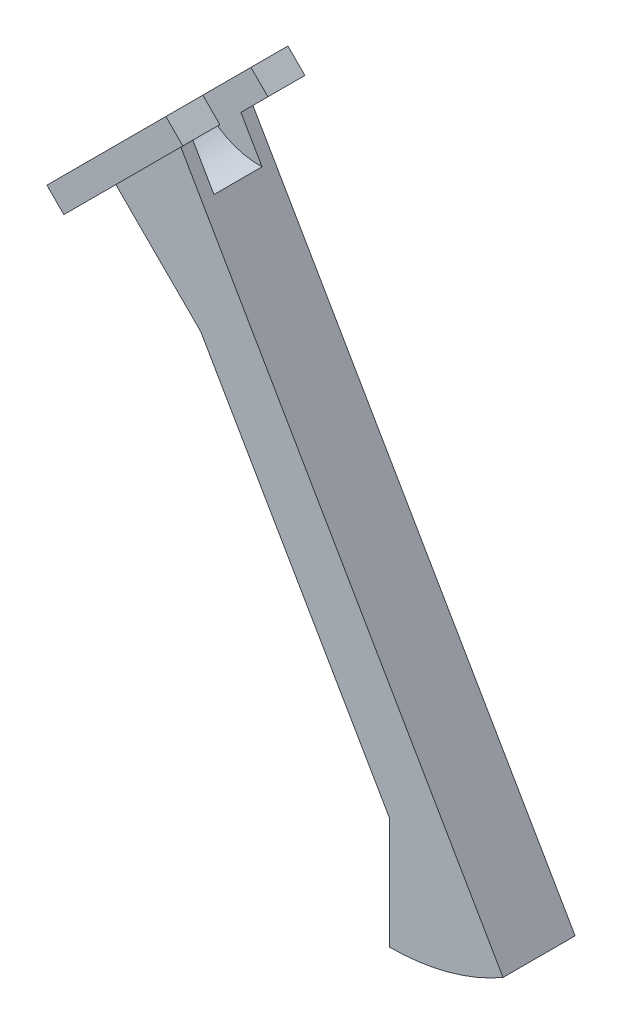
ISO-10303-21;
HEADER;
FILE_DESCRIPTION(('STEP AP214'),'2;1');
FILE_NAME('part.step','',(''),(''),'','','');
FILE_SCHEMA(('AUTOMOTIVE_DESIGN { 1 0 10303 214 1 1 1 1 }'));
ENDSEC;
DATA;
#1=APPLICATION_CONTEXT('core data for automotive mechanical design processes');
#2=APPLICATION_PROTOCOL_DEFINITION('international standard','automotive_design',2000,#1);
#3=PRODUCT_CONTEXT('',#1,'mechanical');
#4=PRODUCT('Part','Part','',(#3));
#5=PRODUCT_RELATED_PRODUCT_CATEGORY('part','',(#4));
#6=PRODUCT_DEFINITION_FORMATION('','',#4);
#7=PRODUCT_DEFINITION_CONTEXT('part definition',#1,'design');
#8=PRODUCT_DEFINITION('design','',#6,#7);
#9=PRODUCT_DEFINITION_SHAPE('','',#8);
#10=(LENGTH_UNIT() NAMED_UNIT(*) SI_UNIT(.MILLI.,.METRE.));
#11=(NAMED_UNIT(*) PLANE_ANGLE_UNIT() SI_UNIT($,.RADIAN.));
#12=(NAMED_UNIT(*) SI_UNIT($,.STERADIAN.) SOLID_ANGLE_UNIT());
#13=UNCERTAINTY_MEASURE_WITH_UNIT(LENGTH_MEASURE(1.E-05),#10,'distance_accuracy_value','');
#14=(GEOMETRIC_REPRESENTATION_CONTEXT(3) GLOBAL_UNCERTAINTY_ASSIGNED_CONTEXT((#13)) GLOBAL_UNIT_ASSIGNED_CONTEXT((#10,
#11,#12)) REPRESENTATION_CONTEXT('',''));
#15=CARTESIAN_POINT('',(0.,0.,0.));
#16=DIRECTION('',(0.,0.,1.));
#17=DIRECTION('',(1.,0.,0.));
#18=AXIS2_PLACEMENT_3D('',#15,#16,#17);
#19=CARTESIAN_POINT('',(-91.2899227988557,91.2899227988554,0.));
#20=DIRECTION('',(0.707106781186549,-0.707106781186546,0.));
#21=DIRECTION('',(0.707106781186546,0.707106781186549,0.));
#22=AXIS2_PLACEMENT_3D('',#19,#20,#21);
#23=PLANE('',#22);
#24=CARTESIAN_POINT('',(-52.1767999017434,130.403045695968,9.52499999999999));
#25=DIRECTION('',(-0.707106781186549,0.707106781186546,0.));
#26=DIRECTION('',(-0.707106781186546,-0.707106781186549,0.));
#27=AXIS2_PLACEMENT_3D('',#24,#25,#26);
#28=CIRCLE('',#27,1.525);
#29=CARTESIAN_POINT('',(-53.2551377430529,129.324707854658,9.52499999999999));
#30=VERTEX_POINT('',#29);
#31=EDGE_CURVE('E194',#30,#30,#28,.T.);
#32=ORIENTED_EDGE('',*,*,#31,.F.);
#33=EDGE_LOOP('',(#32));
#34=FACE_BOUND('',#33,.T.);
#35=DIRECTION('',(0.,0.,1.));
#36=VECTOR('',#35,1.);
#37=CARTESIAN_POINT('',(-59.7854099052376,122.794435692474,-5.));
#38=LINE('',#37,#36);
#39=CARTESIAN_POINT('',(-59.7854099052376,122.794435692474,5.));
#40=VERTEX_POINT('',#39);
#41=CARTESIAN_POINT('',(-59.7854099052376,122.794435692474,-5.));
#42=VERTEX_POINT('',#41);
#43=EDGE_CURVE('E43',#40,#42,#38,.F.);
#44=ORIENTED_EDGE('',*,*,#43,.T.);
#45=DIRECTION('',(-0.707106781186546,-0.707106781186549,0.));
#46=VECTOR('',#45,1.);
#47=CARTESIAN_POINT('',(-91.2899227988557,91.2899227988554,-5.));
#48=LINE('',#47,#46);
#49=CARTESIAN_POINT('',(-49.3271595735617,133.25268602415,-5.));
#50=VERTEX_POINT('',#49);
#51=EDGE_CURVE('E11',#50,#42,#48,.T.);
#52=ORIENTED_EDGE('',*,*,#51,.F.);
#53=DIRECTION('',(0.,0.,-1.));
#54=VECTOR('',#53,1.);
#55=CARTESIAN_POINT('',(-49.3271595735617,133.25268602415,-12.7));
#56=LINE('',#55,#54);
#57=CARTESIAN_POINT('',(-49.3271595735617,133.25268602415,-12.7));
#58=VERTEX_POINT('',#57);
#59=EDGE_CURVE('E248',#50,#58,#56,.T.);
#60=ORIENTED_EDGE('',*,*,#59,.T.);
#61=DIRECTION('',(-0.707106781186546,-0.707106781186549,0.));
#62=VECTOR('',#61,1.);
#63=CARTESIAN_POINT('',(-74.0758969150908,108.50394868262,-12.7));
#64=LINE('',#63,#62);
#65=CARTESIAN_POINT('',(-74.0758969150908,108.50394868262,-12.7));
#66=VERTEX_POINT('',#65);
#67=EDGE_CURVE('E253',#58,#66,#64,.T.);
#68=ORIENTED_EDGE('',*,*,#67,.T.);
#69=DIRECTION('',(0.,0.,1.));
#70=VECTOR('',#69,1.);
#71=CARTESIAN_POINT('',(-74.0758969150908,108.50394868262,-12.7));
#72=LINE('',#71,#70);
#73=CARTESIAN_POINT('',(-74.0758969150908,108.50394868262,12.7));
#74=VERTEX_POINT('',#73);
#75=EDGE_CURVE('E255',#66,#74,#72,.T.);
#76=ORIENTED_EDGE('',*,*,#75,.T.);
#77=DIRECTION('',(0.707106781186546,0.707106781186549,0.));
#78=VECTOR('',#77,1.);
#79=CARTESIAN_POINT('',(-74.0758969150908,108.50394868262,12.7));
#80=LINE('',#79,#78);
#81=CARTESIAN_POINT('',(-49.3271595735617,133.25268602415,12.7));
#82=VERTEX_POINT('',#81);
#83=EDGE_CURVE('E245',#74,#82,#80,.T.);
#84=ORIENTED_EDGE('',*,*,#83,.T.);
#85=CARTESIAN_POINT('',(-49.3271595735617,133.25268602415,5.));
#86=VERTEX_POINT('',#85);
#87=EDGE_CURVE('E250',#82,#86,#56,.T.);
#88=ORIENTED_EDGE('',*,*,#87,.T.);
#89=DIRECTION('',(-0.707106781186546,-0.707106781186549,0.));
#90=VECTOR('',#89,1.);
#91=CARTESIAN_POINT('',(-91.2899227988557,91.2899227988554,5.));
#92=LINE('',#91,#90);
#93=EDGE_CURVE('E327',#86,#40,#92,.T.);
#94=ORIENTED_EDGE('',*,*,#93,.T.);
#95=EDGE_LOOP('',(#44,#52,#60,#68,#76,#84,#88,#94));
#96=FACE_BOUND('',#95,.T.);
#97=CARTESIAN_POINT('',(-71.226256586909,111.353589010802,9.525));
#98=DIRECTION('',(-0.707106781186549,0.707106781186546,0.));
#99=DIRECTION('',(-0.707106781186546,-0.707106781186549,0.));
#100=AXIS2_PLACEMENT_3D('',#97,#98,#99);
#101=CIRCLE('',#100,1.525);
#102=CARTESIAN_POINT('',(-72.3045944282185,110.275251169493,9.525));
#103=VERTEX_POINT('',#102);
#104=EDGE_CURVE('E203',#103,#103,#101,.T.);
#105=ORIENTED_EDGE('',*,*,#104,.F.);
#106=EDGE_LOOP('',(#105));
#107=FACE_BOUND('',#106,.T.);
#108=CARTESIAN_POINT('',(-71.226256586909,111.353589010802,-9.525));
#109=DIRECTION('',(-0.707106781186549,0.707106781186546,0.));
#110=DIRECTION('',(-0.707106781186546,-0.707106781186549,0.));
#111=AXIS2_PLACEMENT_3D('',#108,#109,#110);
#112=CIRCLE('',#111,1.525);
#113=CARTESIAN_POINT('',(-72.3045944282185,110.275251169493,-9.525));
#114=VERTEX_POINT('',#113);
#115=EDGE_CURVE('E212',#114,#114,#112,.T.);
#116=ORIENTED_EDGE('',*,*,#115,.F.);
#117=EDGE_LOOP('',(#116));
#118=FACE_BOUND('',#117,.T.);
#119=CARTESIAN_POINT('',(-52.1767999017434,130.403045695968,-9.525));
#120=DIRECTION('',(-0.707106781186549,0.707106781186546,0.));
#121=DIRECTION('',(-0.707106781186546,-0.707106781186549,0.));
#122=AXIS2_PLACEMENT_3D('',#119,#120,#121);
#123=CIRCLE('',#122,1.525);
#124=CARTESIAN_POINT('',(-53.2551377430529,129.324707854658,-9.525));
#125=VERTEX_POINT('',#124);
#126=EDGE_CURVE('E185',#125,#125,#123,.T.);
#127=ORIENTED_EDGE('',*,*,#126,.F.);
#128=EDGE_LOOP('',(#127));
#129=FACE_BOUND('',#128,.T.);
#130=ADVANCED_FACE('F35',(#34,#96,#107,#118,#129),#23,.F.);
#131=CARTESIAN_POINT('',(15.1843707275717,8.76670052703861,7.5));
#132=DIRECTION('',(-0.866025403784438,-0.500000000000001,0.));
#133=DIRECTION('',(0.500000000000001,-0.866025403784438,0.));
#134=AXIS2_PLACEMENT_3D('',#131,#132,#133);
#135=PLANE('',#134);
#136=DIRECTION('',(0.,0.,1.));
#137=VECTOR('',#136,1.);
#138=CARTESIAN_POINT('',(-47.0125290667509,116.494891044075,-5.));
#139=LINE('',#138,#137);
#140=CARTESIAN_POINT('',(-47.0125290667509,116.494891044075,-5.));
#141=VERTEX_POINT('',#140);
#142=CARTESIAN_POINT('',(-47.0125290667509,116.494891044075,5.));
#143=VERTEX_POINT('',#142);
#144=EDGE_CURVE('E242',#141,#143,#139,.T.);
#145=ORIENTED_EDGE('',*,*,#144,.T.);
#146=DIRECTION('',(-0.500000000000001,0.866025403784438,0.));
#147=VECTOR('',#146,1.);
#148=CARTESIAN_POINT('',(15.1843707275717,8.76670052703861,5.));
#149=LINE('',#148,#147);
#150=CARTESIAN_POINT('',(-51.4053308557114,124.103446930134,5.));
#151=VERTEX_POINT('',#150);
#152=EDGE_CURVE('E232',#143,#151,#149,.T.);
#153=ORIENTED_EDGE('',*,*,#152,.T.);
#154=DIRECTION('',(0.,0.,-1.));
#155=VECTOR('',#154,1.);
#156=CARTESIAN_POINT('',(-51.4053308557114,124.103446930134,7.5));
#157=LINE('',#156,#155);
#158=CARTESIAN_POINT('',(-51.4053308557114,124.103446930134,7.5));
#159=VERTEX_POINT('',#158);
#160=EDGE_CURVE('E324',#159,#151,#157,.T.);
#161=ORIENTED_EDGE('',*,*,#160,.F.);
#162=DIRECTION('',(-0.500000000000001,0.866025403784438,0.));
#163=VECTOR('',#162,1.);
#164=CARTESIAN_POINT('',(15.1843707275717,8.76670052703861,7.5));
#165=LINE('',#164,#163);
#166=CARTESIAN_POINT('',(15.6208471905528,8.01070111684744,7.5));
#167=VERTEX_POINT('',#166);
#168=EDGE_CURVE('E289',#167,#159,#165,.T.);
#169=ORIENTED_EDGE('',*,*,#168,.F.);
#170=DIRECTION('',(0.,0.,1.));
#171=VECTOR('',#170,1.);
#172=CARTESIAN_POINT('',(15.6208471905528,8.01070111684744,-7.5));
#173=LINE('',#172,#171);
#174=CARTESIAN_POINT('',(15.6208471905528,8.01070111684744,-7.5));
#175=VERTEX_POINT('',#174);
#176=EDGE_CURVE('E278',#175,#167,#173,.T.);
#177=ORIENTED_EDGE('',*,*,#176,.F.);
#178=DIRECTION('',(-0.500000000000001,0.866025403784438,0.));
#179=VECTOR('',#178,1.);
#180=CARTESIAN_POINT('',(15.1843707275717,8.76670052703861,-7.5));
#181=LINE('',#180,#179);
#182=CARTESIAN_POINT('',(-51.4053308557114,124.103446930134,-7.5));
#183=VERTEX_POINT('',#182);
#184=EDGE_CURVE('E288',#175,#183,#181,.T.);
#185=ORIENTED_EDGE('',*,*,#184,.T.);
#186=CARTESIAN_POINT('',(-51.4053308557114,124.103446930134,-5.));
#187=VERTEX_POINT('',#186);
#188=EDGE_CURVE('E323',#187,#183,#157,.T.);
#189=ORIENTED_EDGE('',*,*,#188,.F.);
#190=DIRECTION('',(-0.500000000000001,0.866025403784438,0.));
#191=VECTOR('',#190,1.);
#192=CARTESIAN_POINT('',(15.1843707275717,8.76670052703861,-5.));
#193=LINE('',#192,#191);
#194=EDGE_CURVE('E240',#141,#187,#193,.T.);
#195=ORIENTED_EDGE('',*,*,#194,.F.);
#196=EDGE_LOOP('',(#145,#153,#161,#169,#177,#185,#189,#195));
#197=FACE_BOUND('',#196,.T.);
#198=ADVANCED_FACE('F37',(#197),#135,.F.);
#199=CARTESIAN_POINT('',(-87.754388892923,87.7543888929226,0.));
#200=DIRECTION('',(0.707106781186549,-0.707106781186546,0.));
#201=DIRECTION('',(0.707106781186546,0.707106781186549,0.));
#202=AXIS2_PLACEMENT_3D('',#199,#200,#201);
#203=PLANE('',#202);
#204=DIRECTION('',(-0.707106781186546,-0.707106781186549,0.));
#205=VECTOR('',#204,1.);
#206=CARTESIAN_POINT('',(-87.754388892923,87.7543888929226,2.5));
#207=LINE('',#206,#205);
#208=CARTESIAN_POINT('',(-64.9266578210755,110.58211996477,2.5));
#209=VERTEX_POINT('',#208);
#210=CARTESIAN_POINT('',(-69.1261494467849,106.382628339061,2.5));
#211=VERTEX_POINT('',#210);
#212=EDGE_CURVE('E169',#209,#211,#207,.T.);
#213=ORIENTED_EDGE('',*,*,#212,.F.);
#214=DIRECTION('',(0.,0.,-1.));
#215=VECTOR('',#214,1.);
#216=CARTESIAN_POINT('',(-64.9266578210755,110.58211996477,7.5));
#217=LINE('',#216,#215);
#218=CARTESIAN_POINT('',(-64.9266578210756,110.58211996477,7.5));
#219=VERTEX_POINT('',#218);
#220=EDGE_CURVE('E321',#219,#209,#217,.T.);
#221=ORIENTED_EDGE('',*,*,#220,.F.);
#222=DIRECTION('',(-0.707106781186546,-0.707106781186549,0.));
#223=VECTOR('',#222,1.);
#224=CARTESIAN_POINT('',(-87.7543888929229,87.7543888929226,7.5));
#225=LINE('',#224,#223);
#226=EDGE_CURVE('E292',#159,#219,#225,.T.);
#227=ORIENTED_EDGE('',*,*,#226,.F.);
#228=ORIENTED_EDGE('',*,*,#160,.T.);
#229=DIRECTION('',(-0.707106781186546,-0.707106781186549,0.));
#230=VECTOR('',#229,1.);
#231=CARTESIAN_POINT('',(-87.754388892923,87.7543888929226,5.));
#232=LINE('',#231,#230);
#233=CARTESIAN_POINT('',(-45.7916256676289,129.717152118217,5.));
#234=VERTEX_POINT('',#233);
#235=EDGE_CURVE('E230',#234,#151,#232,.T.);
#236=ORIENTED_EDGE('',*,*,#235,.F.);
#237=DIRECTION('',(0.,0.,-1.));
#238=VECTOR('',#237,1.);
#239=CARTESIAN_POINT('',(-45.7916256676289,129.717152118217,-12.7));
#240=LINE('',#239,#238);
#241=CARTESIAN_POINT('',(-45.7916256676289,129.717152118217,12.7));
#242=VERTEX_POINT('',#241);
#243=EDGE_CURVE('E261',#242,#234,#240,.T.);
#244=ORIENTED_EDGE('',*,*,#243,.F.);
#245=DIRECTION('',(0.707106781186546,0.707106781186549,0.));
#246=VECTOR('',#245,1.);
#247=CARTESIAN_POINT('',(-70.540363009158,104.968414776688,12.7));
#248=LINE('',#247,#246);
#249=CARTESIAN_POINT('',(-70.540363009158,104.968414776688,12.7));
#250=VERTEX_POINT('',#249);
#251=EDGE_CURVE('E244',#250,#242,#248,.T.);
#252=ORIENTED_EDGE('',*,*,#251,.F.);
#253=DIRECTION('',(0.,0.,1.));
#254=VECTOR('',#253,1.);
#255=CARTESIAN_POINT('',(-70.540363009158,104.968414776688,-12.7));
#256=LINE('',#255,#254);
#257=CARTESIAN_POINT('',(-70.540363009158,104.968414776688,-12.7));
#258=VERTEX_POINT('',#257);
#259=EDGE_CURVE('E249',#258,#250,#256,.T.);
#260=ORIENTED_EDGE('',*,*,#259,.F.);
#261=DIRECTION('',(-0.707106781186546,-0.707106781186549,0.));
#262=VECTOR('',#261,1.);
#263=CARTESIAN_POINT('',(-70.540363009158,104.968414776688,-12.7));
#264=LINE('',#263,#262);
#265=CARTESIAN_POINT('',(-45.7916256676289,129.717152118217,-12.7));
#266=VERTEX_POINT('',#265);
#267=EDGE_CURVE('E264',#266,#258,#264,.T.);
#268=ORIENTED_EDGE('',*,*,#267,.F.);
#269=CARTESIAN_POINT('',(-45.7916256676289,129.717152118217,-5.));
#270=VERTEX_POINT('',#269);
#271=EDGE_CURVE('E260',#270,#266,#240,.T.);
#272=ORIENTED_EDGE('',*,*,#271,.F.);
#273=DIRECTION('',(-0.707106781186546,-0.707106781186549,0.));
#274=VECTOR('',#273,1.);
#275=CARTESIAN_POINT('',(-87.754388892923,87.7543888929226,-5.));
#276=LINE('',#275,#274);
#277=EDGE_CURVE('E237',#270,#187,#276,.T.);
#278=ORIENTED_EDGE('',*,*,#277,.T.);
#279=ORIENTED_EDGE('',*,*,#188,.T.);
#280=DIRECTION('',(-0.707106781186546,-0.707106781186549,0.));
#281=VECTOR('',#280,1.);
#282=CARTESIAN_POINT('',(-87.7543888929229,87.7543888929226,-7.5));
#283=LINE('',#282,#281);
#284=CARTESIAN_POINT('',(-64.9266578210755,110.58211996477,-7.5));
#285=VERTEX_POINT('',#284);
#286=EDGE_CURVE('E306',#183,#285,#283,.T.);
#287=ORIENTED_EDGE('',*,*,#286,.T.);
#288=CARTESIAN_POINT('',(-64.9266578210755,110.58211996477,-2.5));
#289=VERTEX_POINT('',#288);
#290=EDGE_CURVE('E320',#289,#285,#217,.T.);
#291=ORIENTED_EDGE('',*,*,#290,.F.);
#292=DIRECTION('',(-0.707106781186546,-0.707106781186549,0.));
#293=VECTOR('',#292,1.);
#294=CARTESIAN_POINT('',(-87.754388892923,87.7543888929226,-2.5));
#295=LINE('',#294,#293);
#296=CARTESIAN_POINT('',(-69.1261494467849,106.382628339061,-2.5));
#297=VERTEX_POINT('',#296);
#298=EDGE_CURVE('E55',#289,#297,#295,.T.);
#299=ORIENTED_EDGE('',*,*,#298,.T.);
#300=DIRECTION('',(0.,0.,-1.));
#301=VECTOR('',#300,1.);
#302=CARTESIAN_POINT('',(-69.1261494467849,106.382628339061,0.));
#303=LINE('',#302,#301);
#304=EDGE_CURVE('E50',#211,#297,#303,.T.);
#305=ORIENTED_EDGE('',*,*,#304,.F.);
#306=EDGE_LOOP('',(#213,#221,#227,#228,#236,#244,#252,#260,#268,#272,#278,#279,#287,#291,#299,#305));
#307=FACE_BOUND('',#306,.T.);
#308=CARTESIAN_POINT('',(-48.6412659958107,126.867511790035,-9.525));
#309=DIRECTION('',(0.707106781186549,-0.707106781186546,0.));
#310=DIRECTION('',(0.707106781186546,0.707106781186549,0.));
#311=AXIS2_PLACEMENT_3D('',#308,#309,#310);
#312=CIRCLE('',#311,1.49999999999999);
#313=CARTESIAN_POINT('',(-47.5806058240309,127.928171961815,-9.525));
#314=VERTEX_POINT('',#313);
#315=EDGE_CURVE('E191',#314,#314,#312,.T.);
#316=ORIENTED_EDGE('',*,*,#315,.F.);
#317=EDGE_LOOP('',(#316));
#318=FACE_BOUND('',#317,.T.);
#319=CARTESIAN_POINT('',(-48.6412659958107,126.867511790035,9.52499999999999));
#320=DIRECTION('',(0.707106781186549,-0.707106781186546,0.));
#321=DIRECTION('',(0.707106781186546,0.707106781186549,0.));
#322=AXIS2_PLACEMENT_3D('',#319,#320,#321);
#323=CIRCLE('',#322,1.49999999999999);
#324=CARTESIAN_POINT('',(-47.5806058240309,127.928171961815,9.52499999999999));
#325=VERTEX_POINT('',#324);
#326=EDGE_CURVE('E200',#325,#325,#323,.T.);
#327=ORIENTED_EDGE('',*,*,#326,.F.);
#328=EDGE_LOOP('',(#327));
#329=FACE_BOUND('',#328,.T.);
#330=CARTESIAN_POINT('',(-67.6907226809763,107.818055104869,9.525));
#331=DIRECTION('',(0.707106781186549,-0.707106781186546,0.));
#332=DIRECTION('',(0.707106781186546,0.707106781186549,0.));
#333=AXIS2_PLACEMENT_3D('',#330,#331,#332);
#334=CIRCLE('',#333,1.49999999999999);
#335=CARTESIAN_POINT('',(-66.6300625091964,108.878715276649,9.525));
#336=VERTEX_POINT('',#335);
#337=EDGE_CURVE('E209',#336,#336,#334,.T.);
#338=ORIENTED_EDGE('',*,*,#337,.F.);
#339=EDGE_LOOP('',(#338));
#340=FACE_BOUND('',#339,.T.);
#341=CARTESIAN_POINT('',(-67.6907226809763,107.818055104869,-9.525));
#342=DIRECTION('',(0.707106781186549,-0.707106781186546,0.));
#343=DIRECTION('',(0.707106781186546,0.707106781186549,0.));
#344=AXIS2_PLACEMENT_3D('',#341,#342,#343);
#345=CIRCLE('',#344,1.49999999999999);
#346=CARTESIAN_POINT('',(-66.6300625091964,108.878715276649,-9.525));
#347=VERTEX_POINT('',#346);
#348=EDGE_CURVE('E218',#347,#347,#345,.T.);
#349=ORIENTED_EDGE('',*,*,#348,.F.);
#350=EDGE_LOOP('',(#349));
#351=FACE_BOUND('',#350,.T.);
#352=ADVANCED_FACE('F348',(#307,#318,#329,#340,#351),#203,.T.);
#353=CARTESIAN_POINT('',(-49.3271595735617,133.25268602415,-12.7));
#354=DIRECTION('',(-0.707106781186546,-0.707106781186549,0.));
#355=DIRECTION('',(0.707106781186549,-0.707106781186546,0.));
#356=AXIS2_PLACEMENT_3D('',#353,#354,#355);
#357=PLANE('',#356);
#358=DIRECTION('',(-0.707106781186549,0.707106781186546,0.));
#359=VECTOR('',#358,1.);
#360=CARTESIAN_POINT('',(-49.3271595735617,133.25268602415,-5.));
#361=LINE('',#360,#359);
#362=EDGE_CURVE('E235',#270,#50,#361,.T.);
#363=ORIENTED_EDGE('',*,*,#362,.F.);
#364=ORIENTED_EDGE('',*,*,#271,.T.);
#365=DIRECTION('',(0.707106781186549,-0.707106781186546,0.));
#366=VECTOR('',#365,1.);
#367=CARTESIAN_POINT('',(-49.3271595735617,133.25268602415,-12.7));
#368=LINE('',#367,#366);
#369=EDGE_CURVE('E272',#58,#266,#368,.T.);
#370=ORIENTED_EDGE('',*,*,#369,.F.);
#371=ORIENTED_EDGE('',*,*,#59,.F.);
#372=EDGE_LOOP('',(#363,#364,#370,#371));
#373=FACE_BOUND('',#372,.T.);
#374=ADVANCED_FACE('F370',(#373),#357,.F.);
#375=CARTESIAN_POINT('',(0.,0.,7.5));
#376=DIRECTION('',(0.,0.,1.));
#377=DIRECTION('',(1.,0.,0.));
#378=AXIS2_PLACEMENT_3D('',#375,#376,#377);
#379=PLANE('',#378);
#380=CARTESIAN_POINT('',(-8.04433555352948,49.0000000000002,7.5));
#381=DIRECTION('',(0.,0.,1.));
#382=DIRECTION('',(1.,0.,0.));
#383=AXIS2_PLACEMENT_3D('',#380,#381,#382);
#384=CIRCLE('',#383,47.3303654881645);
#385=CARTESIAN_POINT('',(-8.04433555352943,1.66963451183565,7.5));
#386=VERTEX_POINT('',#385);
#387=EDGE_CURVE('E281',#386,#167,#384,.T.);
#388=ORIENTED_EDGE('',*,*,#387,.T.);
#389=ORIENTED_EDGE('',*,*,#168,.T.);
#390=ORIENTED_EDGE('',*,*,#226,.T.);
#391=DIRECTION('',(0.707106781186548,-0.707106781186547,0.));
#392=VECTOR('',#391,1.);
#393=CARTESIAN_POINT('',(22.8277310718474,22.8277310718474,7.5));
#394=LINE('',#393,#392);
#395=CARTESIAN_POINT('',(-47.2489882914118,92.9044504351064,7.5));
#396=VERTEX_POINT('',#395);
#397=EDGE_CURVE('E296',#219,#396,#394,.T.);
#398=ORIENTED_EDGE('',*,*,#397,.T.);
#399=DIRECTION('',(0.500000000000001,-0.866025403784438,0.));
#400=VECTOR('',#399,1.);
#401=CARTESIAN_POINT('',(4.79206588215843,2.7667005270386,7.5));
#402=LINE('',#401,#400);
#403=CARTESIAN_POINT('',(-8.04433555352943,25.,7.5));
#404=VERTEX_POINT('',#403);
#405=EDGE_CURVE('E298',#396,#404,#402,.T.);
#406=ORIENTED_EDGE('',*,*,#405,.T.);
#407=DIRECTION('',(0.,1.,0.));
#408=VECTOR('',#407,1.);
#409=CARTESIAN_POINT('',(-8.04433555352943,0.,7.5));
#410=LINE('',#409,#408);
#411=EDGE_CURVE('E301',#386,#404,#410,.T.);
#412=ORIENTED_EDGE('',*,*,#411,.F.);
#413=EDGE_LOOP('',(#388,#389,#390,#398,#406,#412));
#414=FACE_BOUND('',#413,.T.);
#415=ADVANCED_FACE('F391',(#414),#379,.T.);
#416=CARTESIAN_POINT('',(0.,0.,-7.5));
#417=DIRECTION('',(0.,0.,1.));
#418=DIRECTION('',(1.,0.,0.));
#419=AXIS2_PLACEMENT_3D('',#416,#417,#418);
#420=PLANE('',#419);
#421=ORIENTED_EDGE('',*,*,#184,.F.);
#422=CARTESIAN_POINT('',(-8.04433555352948,49.0000000000002,-7.5));
#423=DIRECTION('',(0.,0.,1.));
#424=DIRECTION('',(1.,0.,0.));
#425=AXIS2_PLACEMENT_3D('',#422,#423,#424);
#426=CIRCLE('',#425,47.3303654881645);
#427=CARTESIAN_POINT('',(-8.04433555352943,1.66963451183565,-7.5));
#428=VERTEX_POINT('',#427);
#429=EDGE_CURVE('E283',#428,#175,#426,.T.);
#430=ORIENTED_EDGE('',*,*,#429,.F.);
#431=DIRECTION('',(0.,1.,0.));
#432=VECTOR('',#431,1.);
#433=CARTESIAN_POINT('',(-8.04433555352943,0.,-7.5));
#434=LINE('',#433,#432);
#435=CARTESIAN_POINT('',(-8.04433555352943,25.,-7.5));
#436=VERTEX_POINT('',#435);
#437=EDGE_CURVE('E293',#428,#436,#434,.T.);
#438=ORIENTED_EDGE('',*,*,#437,.T.);
#439=DIRECTION('',(0.500000000000001,-0.866025403784438,0.));
#440=VECTOR('',#439,1.);
#441=CARTESIAN_POINT('',(4.79206588215843,2.7667005270386,-7.5));
#442=LINE('',#441,#440);
#443=CARTESIAN_POINT('',(-47.2489882914118,92.9044504351064,-7.5));
#444=VERTEX_POINT('',#443);
#445=EDGE_CURVE('E311',#444,#436,#442,.T.);
#446=ORIENTED_EDGE('',*,*,#445,.F.);
#447=DIRECTION('',(0.707106781186548,-0.707106781186547,0.));
#448=VECTOR('',#447,1.);
#449=CARTESIAN_POINT('',(22.8277310718474,22.8277310718474,-7.5));
#450=LINE('',#449,#448);
#451=EDGE_CURVE('E309',#285,#444,#450,.T.);
#452=ORIENTED_EDGE('',*,*,#451,.F.);
#453=ORIENTED_EDGE('',*,*,#286,.F.);
#454=EDGE_LOOP('',(#421,#430,#438,#446,#452,#453));
#455=FACE_BOUND('',#454,.T.);
#456=ADVANCED_FACE('F378',(#455),#420,.F.);
#457=CARTESIAN_POINT('',(-8.04433555352943,0.,7.5));
#458=DIRECTION('',(-1.,0.,0.));
#459=DIRECTION('',(0.,0.,1.));
#460=AXIS2_PLACEMENT_3D('',#457,#458,#459);
#461=PLANE('',#460);
#462=ORIENTED_EDGE('',*,*,#437,.F.);
#463=DIRECTION('',(0.,0.,1.));
#464=VECTOR('',#463,1.);
#465=CARTESIAN_POINT('',(-8.04433555352943,1.66963451183565,-7.5));
#466=LINE('',#465,#464);
#467=EDGE_CURVE('E285',#428,#386,#466,.T.);
#468=ORIENTED_EDGE('',*,*,#467,.T.);
#469=ORIENTED_EDGE('',*,*,#411,.T.);
#470=DIRECTION('',(0.,0.,-1.));
#471=VECTOR('',#470,1.);
#472=CARTESIAN_POINT('',(-8.04433555352943,25.,7.5));
#473=LINE('',#472,#471);
#474=EDGE_CURVE('E303',#404,#436,#473,.T.);
#475=ORIENTED_EDGE('',*,*,#474,.T.);
#476=EDGE_LOOP('',(#462,#468,#469,#475));
#477=FACE_BOUND('',#476,.T.);
#478=ADVANCED_FACE('F388',(#477),#461,.T.);
#479=CARTESIAN_POINT('',(22.8277310718474,22.8277310718474,7.5));
#480=DIRECTION('',(0.707106781186547,0.707106781186549,0.));
#481=DIRECTION('',(-0.707106781186549,0.707106781186547,0.));
#482=AXIS2_PLACEMENT_3D('',#479,#480,#481);
#483=PLANE('',#482);
#484=ORIENTED_EDGE('',*,*,#220,.T.);
#485=DIRECTION('',(0.707106781186549,-0.707106781186547,0.));
#486=VECTOR('',#485,1.);
#487=CARTESIAN_POINT('',(22.8277310718474,22.8277310718474,2.5));
#488=LINE('',#487,#486);
#489=CARTESIAN_POINT('',(-57.6529249593869,103.308387103081,2.5));
#490=VERTEX_POINT('',#489);
#491=EDGE_CURVE('E164',#209,#490,#488,.T.);
#492=ORIENTED_EDGE('',*,*,#491,.T.);
#493=DIRECTION('',(0.,0.,-1.));
#494=VECTOR('',#493,1.);
#495=CARTESIAN_POINT('',(-57.6529249593869,103.308387103081,7.5));
#496=LINE('',#495,#494);
#497=CARTESIAN_POINT('',(-57.6529249593869,103.308387103081,-2.5));
#498=VERTEX_POINT('',#497);
#499=EDGE_CURVE('E158',#490,#498,#496,.T.);
#500=ORIENTED_EDGE('',*,*,#499,.T.);
#501=DIRECTION('',(0.707106781186549,-0.707106781186547,0.));
#502=VECTOR('',#501,1.);
#503=CARTESIAN_POINT('',(22.8277310718474,22.8277310718474,-2.5));
#504=LINE('',#503,#502);
#505=EDGE_CURVE('E162',#289,#498,#504,.T.);
#506=ORIENTED_EDGE('',*,*,#505,.F.);
#507=ORIENTED_EDGE('',*,*,#290,.T.);
#508=ORIENTED_EDGE('',*,*,#451,.T.);
#509=DIRECTION('',(0.,0.,-1.));
#510=VECTOR('',#509,1.);
#511=CARTESIAN_POINT('',(-47.2489882914118,92.9044504351064,7.5));
#512=LINE('',#511,#510);
#513=EDGE_CURVE('E317',#396,#444,#512,.T.);
#514=ORIENTED_EDGE('',*,*,#513,.F.);
#515=ORIENTED_EDGE('',*,*,#397,.F.);
#516=EDGE_LOOP('',(#484,#492,#500,#506,#507,#508,#514,#515));
#517=FACE_BOUND('',#516,.T.);
#518=ADVANCED_FACE('F161',(#517),#483,.F.);
#519=CARTESIAN_POINT('',(4.79206588215843,2.7667005270386,7.5));
#520=DIRECTION('',(0.866025403784438,0.500000000000001,0.));
#521=DIRECTION('',(-0.500000000000001,0.866025403784438,0.));
#522=AXIS2_PLACEMENT_3D('',#519,#520,#521);
#523=PLANE('',#522);
#524=ORIENTED_EDGE('',*,*,#445,.T.);
#525=ORIENTED_EDGE('',*,*,#474,.F.);
#526=ORIENTED_EDGE('',*,*,#405,.F.);
#527=ORIENTED_EDGE('',*,*,#513,.T.);
#528=EDGE_LOOP('',(#524,#525,#526,#527));
#529=FACE_BOUND('',#528,.T.);
#530=ADVANCED_FACE('F384',(#529),#523,.F.);
#531=CARTESIAN_POINT('',(-8.04433555352948,49.0000000000002,-7.5));
#532=DIRECTION('',(0.,0.,1.));
#533=DIRECTION('',(1.,0.,0.));
#534=AXIS2_PLACEMENT_3D('',#531,#532,#533);
#535=CYLINDRICAL_SURFACE('',#534,47.3303654881645);
#536=ORIENTED_EDGE('',*,*,#467,.F.);
#537=ORIENTED_EDGE('',*,*,#429,.T.);
#538=ORIENTED_EDGE('',*,*,#176,.T.);
#539=ORIENTED_EDGE('',*,*,#387,.F.);
#540=EDGE_LOOP('',(#536,#537,#538,#539));
#541=FACE_BOUND('',#540,.T.);
#542=ADVANCED_FACE('F424',(#541),#535,.T.);
#543=CARTESIAN_POINT('',(-74.0758969150908,108.50394868262,12.7));
#544=DIRECTION('',(0.,0.,-1.));
#545=DIRECTION('',(-1.,0.,0.));
#546=AXIS2_PLACEMENT_3D('',#543,#544,#545);
#547=PLANE('',#546);
#548=ORIENTED_EDGE('',*,*,#251,.T.);
#549=DIRECTION('',(0.707106781186549,-0.707106781186546,0.));
#550=VECTOR('',#549,1.);
#551=CARTESIAN_POINT('',(-49.3271595735617,133.25268602415,12.7));
#552=LINE('',#551,#550);
#553=EDGE_CURVE('E275',#82,#242,#552,.T.);
#554=ORIENTED_EDGE('',*,*,#553,.F.);
#555=ORIENTED_EDGE('',*,*,#83,.F.);
#556=DIRECTION('',(0.707106781186549,-0.707106781186546,0.));
#557=VECTOR('',#556,1.);
#558=CARTESIAN_POINT('',(-74.0758969150908,108.50394868262,12.7));
#559=LINE('',#558,#557);
#560=EDGE_CURVE('E257',#74,#250,#559,.T.);
#561=ORIENTED_EDGE('',*,*,#560,.T.);
#562=EDGE_LOOP('',(#548,#554,#555,#561));
#563=FACE_BOUND('',#562,.T.);
#564=ADVANCED_FACE('F356',(#563),#547,.F.);
#565=ORIENTED_EDGE('',*,*,#243,.T.);
#566=DIRECTION('',(-0.707106781186549,0.707106781186546,0.));
#567=VECTOR('',#566,1.);
#568=CARTESIAN_POINT('',(-49.3271595735617,133.25268602415,5.));
#569=LINE('',#568,#567);
#570=EDGE_CURVE('E225',#234,#86,#569,.T.);
#571=ORIENTED_EDGE('',*,*,#570,.T.);
#572=ORIENTED_EDGE('',*,*,#87,.F.);
#573=ORIENTED_EDGE('',*,*,#553,.T.);
#574=EDGE_LOOP('',(#565,#571,#572,#573));
#575=FACE_BOUND('',#574,.T.);
#576=ADVANCED_FACE('F352',(#575),#357,.F.);
#577=CARTESIAN_POINT('',(-74.0758969150908,108.50394868262,-12.7));
#578=DIRECTION('',(0.,0.,1.));
#579=DIRECTION('',(1.,0.,0.));
#580=AXIS2_PLACEMENT_3D('',#577,#578,#579);
#581=PLANE('',#580);
#582=ORIENTED_EDGE('',*,*,#267,.T.);
#583=DIRECTION('',(0.707106781186549,-0.707106781186546,0.));
#584=VECTOR('',#583,1.);
#585=CARTESIAN_POINT('',(-74.0758969150908,108.50394868262,-12.7));
#586=LINE('',#585,#584);
#587=EDGE_CURVE('E269',#66,#258,#586,.T.);
#588=ORIENTED_EDGE('',*,*,#587,.F.);
#589=ORIENTED_EDGE('',*,*,#67,.F.);
#590=ORIENTED_EDGE('',*,*,#369,.T.);
#591=EDGE_LOOP('',(#582,#588,#589,#590));
#592=FACE_BOUND('',#591,.T.);
#593=ADVANCED_FACE('F367',(#592),#581,.F.);
#594=CARTESIAN_POINT('',(-74.0758969150908,108.50394868262,-12.7));
#595=DIRECTION('',(0.707106781186546,0.707106781186549,0.));
#596=DIRECTION('',(-0.707106781186549,0.707106781186546,0.));
#597=AXIS2_PLACEMENT_3D('',#594,#595,#596);
#598=PLANE('',#597);
#599=ORIENTED_EDGE('',*,*,#560,.F.);
#600=ORIENTED_EDGE('',*,*,#75,.F.);
#601=ORIENTED_EDGE('',*,*,#587,.T.);
#602=ORIENTED_EDGE('',*,*,#259,.T.);
#603=EDGE_LOOP('',(#599,#600,#601,#602));
#604=FACE_BOUND('',#603,.T.);
#605=ADVANCED_FACE('F362',(#604),#598,.F.);
#606=CARTESIAN_POINT('',(-47.5593926205953,131.484919071183,-5.));
#607=DIRECTION('',(0.,0.,1.));
#608=DIRECTION('',(1.,0.,0.));
#609=AXIS2_PLACEMENT_3D('',#606,#607,#608);
#610=CYLINDRICAL_SURFACE('',#609,15.);
#611=CARTESIAN_POINT('',(-47.5593926205953,131.484919071183,5.));
#612=DIRECTION('',(0.,0.,1.));
#613=DIRECTION('',(1.,0.,0.));
#614=AXIS2_PLACEMENT_3D('',#611,#612,#613);
#615=CIRCLE('',#614,15.);
#616=EDGE_CURVE('E221',#40,#143,#615,.T.);
#617=ORIENTED_EDGE('',*,*,#616,.T.);
#618=ORIENTED_EDGE('',*,*,#144,.F.);
#619=CARTESIAN_POINT('',(-47.5593926205953,131.484919071183,-5.));
#620=DIRECTION('',(0.,0.,1.));
#621=DIRECTION('',(1.,0.,0.));
#622=AXIS2_PLACEMENT_3D('',#619,#620,#621);
#623=CIRCLE('',#622,15.);
#624=EDGE_CURVE('E222',#42,#141,#623,.T.);
#625=ORIENTED_EDGE('',*,*,#624,.F.);
#626=ORIENTED_EDGE('',*,*,#43,.F.);
#627=EDGE_LOOP('',(#617,#618,#625,#626));
#628=FACE_BOUND('',#627,.T.);
#629=ADVANCED_FACE('F340',(#628),#610,.F.);
#630=CARTESIAN_POINT('',(-47.5593926205953,131.484919071183,-5.));
#631=DIRECTION('',(0.,0.,1.));
#632=DIRECTION('',(1.,0.,0.));
#633=AXIS2_PLACEMENT_3D('',#630,#631,#632);
#634=PLANE('',#633);
#635=ORIENTED_EDGE('',*,*,#194,.T.);
#636=ORIENTED_EDGE('',*,*,#277,.F.);
#637=ORIENTED_EDGE('',*,*,#362,.T.);
#638=ORIENTED_EDGE('',*,*,#51,.T.);
#639=ORIENTED_EDGE('',*,*,#624,.T.);
#640=EDGE_LOOP('',(#635,#636,#637,#638,#639));
#641=FACE_BOUND('',#640,.T.);
#642=ADVANCED_FACE('F337',(#641),#634,.T.);
#643=CARTESIAN_POINT('',(-47.5593926205953,131.484919071183,5.));
#644=DIRECTION('',(0.,0.,1.));
#645=DIRECTION('',(1.,0.,0.));
#646=AXIS2_PLACEMENT_3D('',#643,#644,#645);
#647=PLANE('',#646);
#648=ORIENTED_EDGE('',*,*,#616,.F.);
#649=ORIENTED_EDGE('',*,*,#93,.F.);
#650=ORIENTED_EDGE('',*,*,#570,.F.);
#651=ORIENTED_EDGE('',*,*,#235,.T.);
#652=ORIENTED_EDGE('',*,*,#152,.F.);
#653=EDGE_LOOP('',(#648,#649,#650,#651,#652));
#654=FACE_BOUND('',#653,.T.);
#655=ADVANCED_FACE('F346',(#654),#647,.F.);
#656=CARTESIAN_POINT('',(-71.226256586909,111.353589010802,-9.525));
#657=DIRECTION('',(-0.707106781186549,0.707106781186546,0.));
#658=DIRECTION('',(-0.707106781186546,-0.707106781186549,0.));
#659=AXIS2_PLACEMENT_3D('',#656,#657,#658);
#660=CYLINDRICAL_SURFACE('',#659,1.49999999999999);
#661=CARTESIAN_POINT('',(-71.2085789173793,111.335911341272,-9.525));
#662=DIRECTION('',(-0.707106781186549,0.707106781186546,0.));
#663=DIRECTION('',(-0.707106781186546,-0.707106781186549,0.));
#664=AXIS2_PLACEMENT_3D('',#661,#662,#663);
#665=CIRCLE('',#664,1.49999999999999);
#666=CARTESIAN_POINT('',(-72.2692390891592,110.275251169493,-9.525));
#667=VERTEX_POINT('',#666);
#668=EDGE_CURVE('E215',#667,#667,#665,.T.);
#669=ORIENTED_EDGE('',*,*,#668,.T.);
#670=EDGE_LOOP('',(#669));
#671=FACE_BOUND('',#670,.T.);
#672=ORIENTED_EDGE('',*,*,#348,.T.);
#673=EDGE_LOOP('',(#672));
#674=FACE_BOUND('',#673,.T.);
#675=ADVANCED_FACE('F521',(#671,#674),#660,.F.);
#676=CARTESIAN_POINT('',(-71.226256586909,111.353589010802,-9.525));
#677=DIRECTION('',(-0.707106781186549,0.707106781186546,0.));
#678=DIRECTION('',(-0.707106781186546,-0.707106781186549,0.));
#679=AXIS2_PLACEMENT_3D('',#676,#677,#678);
#680=CONICAL_SURFACE('',#679,1.525,0.785398163397766);
#681=ORIENTED_EDGE('',*,*,#668,.F.);
#682=EDGE_LOOP('',(#681));
#683=FACE_BOUND('',#682,.T.);
#684=ORIENTED_EDGE('',*,*,#115,.T.);
#685=EDGE_LOOP('',(#684));
#686=FACE_BOUND('',#685,.T.);
#687=ADVANCED_FACE('F513',(#683,#686),#680,.F.);
#688=CARTESIAN_POINT('',(-71.226256586909,111.353589010802,9.525));
#689=DIRECTION('',(-0.707106781186549,0.707106781186546,0.));
#690=DIRECTION('',(-0.707106781186546,-0.707106781186549,0.));
#691=AXIS2_PLACEMENT_3D('',#688,#689,#690);
#692=CYLINDRICAL_SURFACE('',#691,1.49999999999999);
#693=CARTESIAN_POINT('',(-71.2085789173793,111.335911341272,9.525));
#694=DIRECTION('',(-0.707106781186549,0.707106781186546,0.));
#695=DIRECTION('',(-0.707106781186546,-0.707106781186549,0.));
#696=AXIS2_PLACEMENT_3D('',#693,#694,#695);
#697=CIRCLE('',#696,1.49999999999999);
#698=CARTESIAN_POINT('',(-72.2692390891592,110.275251169493,9.525));
#699=VERTEX_POINT('',#698);
#700=EDGE_CURVE('E206',#699,#699,#697,.T.);
#701=ORIENTED_EDGE('',*,*,#700,.T.);
#702=EDGE_LOOP('',(#701));
#703=FACE_BOUND('',#702,.T.);
#704=ORIENTED_EDGE('',*,*,#337,.T.);
#705=EDGE_LOOP('',(#704));
#706=FACE_BOUND('',#705,.T.);
#707=ADVANCED_FACE('F505',(#703,#706),#692,.F.);
#708=CARTESIAN_POINT('',(-71.226256586909,111.353589010802,9.525));
#709=DIRECTION('',(-0.707106781186549,0.707106781186546,0.));
#710=DIRECTION('',(-0.707106781186546,-0.707106781186549,0.));
#711=AXIS2_PLACEMENT_3D('',#708,#709,#710);
#712=CONICAL_SURFACE('',#711,1.525,0.785398163397766);
#713=ORIENTED_EDGE('',*,*,#700,.F.);
#714=EDGE_LOOP('',(#713));
#715=FACE_BOUND('',#714,.T.);
#716=ORIENTED_EDGE('',*,*,#104,.T.);
#717=EDGE_LOOP('',(#716));
#718=FACE_BOUND('',#717,.T.);
#719=ADVANCED_FACE('F497',(#715,#718),#712,.F.);
#720=CARTESIAN_POINT('',(-52.1767999017434,130.403045695968,9.52499999999999));
#721=DIRECTION('',(-0.707106781186549,0.707106781186546,0.));
#722=DIRECTION('',(-0.707106781186546,-0.707106781186549,0.));
#723=AXIS2_PLACEMENT_3D('',#720,#721,#722);
#724=CYLINDRICAL_SURFACE('',#723,1.49999999999999);
#725=CARTESIAN_POINT('',(-52.1591222322138,130.385368026438,9.52499999999999));
#726=DIRECTION('',(-0.707106781186549,0.707106781186546,0.));
#727=DIRECTION('',(-0.707106781186546,-0.707106781186549,0.));
#728=AXIS2_PLACEMENT_3D('',#725,#726,#727);
#729=CIRCLE('',#728,1.49999999999999);
#730=CARTESIAN_POINT('',(-53.2197824039936,129.324707854658,9.52499999999999));
#731=VERTEX_POINT('',#730);
#732=EDGE_CURVE('E197',#731,#731,#729,.T.);
#733=ORIENTED_EDGE('',*,*,#732,.T.);
#734=EDGE_LOOP('',(#733));
#735=FACE_BOUND('',#734,.T.);
#736=ORIENTED_EDGE('',*,*,#326,.T.);
#737=EDGE_LOOP('',(#736));
#738=FACE_BOUND('',#737,.T.);
#739=ADVANCED_FACE('F489',(#735,#738),#724,.F.);
#740=CARTESIAN_POINT('',(-52.1767999017434,130.403045695968,9.52499999999999));
#741=DIRECTION('',(-0.707106781186549,0.707106781186546,0.));
#742=DIRECTION('',(-0.707106781186546,-0.707106781186549,0.));
#743=AXIS2_PLACEMENT_3D('',#740,#741,#742);
#744=CONICAL_SURFACE('',#743,1.525,0.785398163397472);
#745=ORIENTED_EDGE('',*,*,#732,.F.);
#746=EDGE_LOOP('',(#745));
#747=FACE_BOUND('',#746,.T.);
#748=ORIENTED_EDGE('',*,*,#31,.T.);
#749=EDGE_LOOP('',(#748));
#750=FACE_BOUND('',#749,.T.);
#751=ADVANCED_FACE('F481',(#747,#750),#744,.F.);
#752=CARTESIAN_POINT('',(-52.1767999017434,130.403045695968,-9.525));
#753=DIRECTION('',(-0.707106781186549,0.707106781186546,0.));
#754=DIRECTION('',(-0.707106781186546,-0.707106781186549,0.));
#755=AXIS2_PLACEMENT_3D('',#752,#753,#754);
#756=CYLINDRICAL_SURFACE('',#755,1.49999999999999);
#757=CARTESIAN_POINT('',(-52.1591222322138,130.385368026438,-9.525));
#758=DIRECTION('',(-0.707106781186549,0.707106781186546,0.));
#759=DIRECTION('',(-0.707106781186546,-0.707106781186549,0.));
#760=AXIS2_PLACEMENT_3D('',#757,#758,#759);
#761=CIRCLE('',#760,1.49999999999999);
#762=CARTESIAN_POINT('',(-53.2197824039936,129.324707854658,-9.525));
#763=VERTEX_POINT('',#762);
#764=EDGE_CURVE('E188',#763,#763,#761,.T.);
#765=ORIENTED_EDGE('',*,*,#764,.T.);
#766=EDGE_LOOP('',(#765));
#767=FACE_BOUND('',#766,.T.);
#768=ORIENTED_EDGE('',*,*,#315,.T.);
#769=EDGE_LOOP('',(#768));
#770=FACE_BOUND('',#769,.T.);
#771=ADVANCED_FACE('F474',(#767,#770),#756,.F.);
#772=CARTESIAN_POINT('',(-52.1767999017434,130.403045695968,-9.525));
#773=DIRECTION('',(-0.707106781186549,0.707106781186546,0.));
#774=DIRECTION('',(-0.707106781186546,-0.707106781186549,0.));
#775=AXIS2_PLACEMENT_3D('',#772,#773,#774);
#776=CONICAL_SURFACE('',#775,1.525,0.785398163397472);
#777=ORIENTED_EDGE('',*,*,#764,.F.);
#778=EDGE_LOOP('',(#777));
#779=FACE_BOUND('',#778,.T.);
#780=ORIENTED_EDGE('',*,*,#126,.T.);
#781=EDGE_LOOP('',(#780));
#782=FACE_BOUND('',#781,.T.);
#783=ADVANCED_FACE('F401',(#779,#782),#776,.F.);
#784=CARTESIAN_POINT('',(-69.126149446785,106.382628339061,0.));
#785=DIRECTION('',(-0.258819045102523,-0.965925826289068,0.));
#786=DIRECTION('',(0.965925826289068,-0.258819045102523,0.));
#787=AXIS2_PLACEMENT_3D('',#784,#785,#786);
#788=PLANE('',#787);
#789=DIRECTION('',(0.965925826289068,-0.258819045102523,0.));
#790=VECTOR('',#789,1.);
#791=CARTESIAN_POINT('',(-69.126149446785,106.382628339061,2.5));
#792=LINE('',#791,#790);
#793=EDGE_CURVE('E175',#211,#490,#792,.T.);
#794=ORIENTED_EDGE('',*,*,#793,.F.);
#795=ORIENTED_EDGE('',*,*,#304,.T.);
#796=DIRECTION('',(0.965925826289068,-0.258819045102523,0.));
#797=VECTOR('',#796,1.);
#798=CARTESIAN_POINT('',(-69.126149446785,106.382628339061,-2.5));
#799=LINE('',#798,#797);
#800=EDGE_CURVE('E174',#297,#498,#799,.T.);
#801=ORIENTED_EDGE('',*,*,#800,.T.);
#802=ORIENTED_EDGE('',*,*,#499,.F.);
#803=EDGE_LOOP('',(#794,#795,#801,#802));
#804=FACE_BOUND('',#803,.T.);
#805=ADVANCED_FACE('F177',(#804),#788,.T.);
#806=CARTESIAN_POINT('',(-29.227524862269,67.4611602679926,2.5));
#807=DIRECTION('',(0.,0.,1.));
#808=DIRECTION('',(1.,0.,0.));
#809=AXIS2_PLACEMENT_3D('',#806,#807,#808);
#810=PLANE('',#809);
#811=ORIENTED_EDGE('',*,*,#793,.T.);
#812=ORIENTED_EDGE('',*,*,#491,.F.);
#813=ORIENTED_EDGE('',*,*,#212,.T.);
#814=EDGE_LOOP('',(#811,#812,#813));
#815=FACE_BOUND('',#814,.T.);
#816=ADVANCED_FACE('F393',(#815),#810,.T.);
#817=CARTESIAN_POINT('',(-29.227524862269,67.4611602679926,-2.5));
#818=DIRECTION('',(0.,0.,1.));
#819=DIRECTION('',(1.,0.,0.));
#820=AXIS2_PLACEMENT_3D('',#817,#818,#819);
#821=PLANE('',#820);
#822=ORIENTED_EDGE('',*,*,#298,.F.);
#823=ORIENTED_EDGE('',*,*,#505,.T.);
#824=ORIENTED_EDGE('',*,*,#800,.F.);
#825=EDGE_LOOP('',(#822,#823,#824));
#826=FACE_BOUND('',#825,.T.);
#827=ADVANCED_FACE('F173',(#826),#821,.F.);
#828=CLOSED_SHELL('',(#130,#198,#352,#374,#415,#456,#478,#518,#530,#542,#564,#576,#593,#605,
#629,#642,#655,#675,#687,#707,#719,#739,#751,#771,#783,#805,#816,#827));
#829=MANIFOLD_SOLID_BREP('B2',#828);
#830=ADVANCED_BREP_SHAPE_REPRESENTATION('',(#18,#829),#14);
#831=SHAPE_DEFINITION_REPRESENTATION(#9,#830);
ENDSEC;
END-ISO-10303-21;
